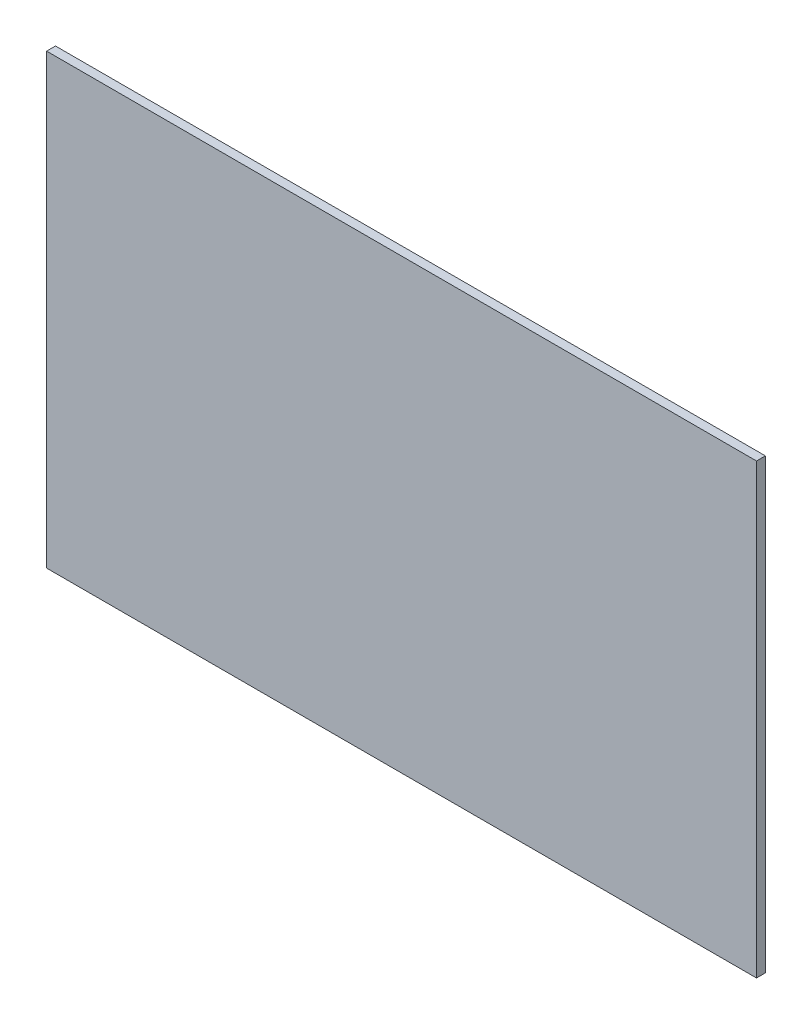
ISO-10303-21;
HEADER;
FILE_DESCRIPTION(('STEP AP214'),'2;1');
FILE_NAME('part.step','',(''),(''),'','','');
FILE_SCHEMA(('AUTOMOTIVE_DESIGN { 1 0 10303 214 1 1 1 1 }'));
ENDSEC;
DATA;
#1=APPLICATION_CONTEXT('core data for automotive mechanical design processes');
#2=APPLICATION_PROTOCOL_DEFINITION('international standard','automotive_design',2000,#1);
#3=PRODUCT_CONTEXT('',#1,'mechanical');
#4=PRODUCT('Part','Part','',(#3));
#5=PRODUCT_RELATED_PRODUCT_CATEGORY('part','',(#4));
#6=PRODUCT_DEFINITION_FORMATION('','',#4);
#7=PRODUCT_DEFINITION_CONTEXT('part definition',#1,'design');
#8=PRODUCT_DEFINITION('design','',#6,#7);
#9=PRODUCT_DEFINITION_SHAPE('','',#8);
#10=(LENGTH_UNIT() NAMED_UNIT(*) SI_UNIT(.MILLI.,.METRE.));
#11=(NAMED_UNIT(*) PLANE_ANGLE_UNIT() SI_UNIT($,.RADIAN.));
#12=(NAMED_UNIT(*) SI_UNIT($,.STERADIAN.) SOLID_ANGLE_UNIT());
#13=UNCERTAINTY_MEASURE_WITH_UNIT(LENGTH_MEASURE(1.E-05),#10,'distance_accuracy_value','');
#14=(GEOMETRIC_REPRESENTATION_CONTEXT(3) GLOBAL_UNCERTAINTY_ASSIGNED_CONTEXT((#13)) GLOBAL_UNIT_ASSIGNED_CONTEXT((#10,
#11,#12)) REPRESENTATION_CONTEXT('',''));
#15=CARTESIAN_POINT('',(0.,0.,0.));
#16=DIRECTION('',(0.,0.,1.));
#17=DIRECTION('',(1.,0.,0.));
#18=AXIS2_PLACEMENT_3D('',#15,#16,#17);
#19=CARTESIAN_POINT('',(762.5,480.95,9.525));
#20=DIRECTION('',(0.,-1.,0.));
#21=DIRECTION('',(0.,0.,-1.));
#22=AXIS2_PLACEMENT_3D('',#19,#20,#21);
#23=PLANE('',#22);
#24=DIRECTION('',(-1.,0.,0.));
#25=VECTOR('',#24,1.);
#26=CARTESIAN_POINT('',(762.5,480.95,0.));
#27=LINE('',#26,#25);
#28=CARTESIAN_POINT('',(762.5,480.95,0.));
#29=VERTEX_POINT('',#28);
#30=CARTESIAN_POINT('',(0.,480.95,0.));
#31=VERTEX_POINT('',#30);
#32=EDGE_CURVE('E104',#29,#31,#27,.T.);
#33=ORIENTED_EDGE('',*,*,#32,.T.);
#34=DIRECTION('',(0.,0.,-1.));
#35=VECTOR('',#34,1.);
#36=CARTESIAN_POINT('',(0.,480.95,9.525));
#37=LINE('',#36,#35);
#38=CARTESIAN_POINT('',(0.,480.95,9.525));
#39=VERTEX_POINT('',#38);
#40=EDGE_CURVE('E11',#39,#31,#37,.T.);
#41=ORIENTED_EDGE('',*,*,#40,.F.);
#42=DIRECTION('',(-1.,0.,0.));
#43=VECTOR('',#42,1.);
#44=CARTESIAN_POINT('',(762.5,480.95,9.525));
#45=LINE('',#44,#43);
#46=CARTESIAN_POINT('',(762.5,480.95,9.525));
#47=VERTEX_POINT('',#46);
#48=EDGE_CURVE('E92',#47,#39,#45,.T.);
#49=ORIENTED_EDGE('',*,*,#48,.F.);
#50=DIRECTION('',(0.,0.,-1.));
#51=VECTOR('',#50,1.);
#52=CARTESIAN_POINT('',(762.5,480.95,9.525));
#53=LINE('',#52,#51);
#54=EDGE_CURVE('E100',#47,#29,#53,.T.);
#55=ORIENTED_EDGE('',*,*,#54,.T.);
#56=EDGE_LOOP('',(#33,#41,#49,#55));
#57=FACE_BOUND('',#56,.T.);
#58=ADVANCED_FACE('F41',(#57),#23,.F.);
#59=CARTESIAN_POINT('',(0.,480.95,9.525));
#60=DIRECTION('',(1.,0.,0.));
#61=DIRECTION('',(0.,0.,-1.));
#62=AXIS2_PLACEMENT_3D('',#59,#60,#61);
#63=PLANE('',#62);
#64=DIRECTION('',(0.,-1.,0.));
#65=VECTOR('',#64,1.);
#66=CARTESIAN_POINT('',(0.,480.95,0.));
#67=LINE('',#66,#65);
#68=CARTESIAN_POINT('',(0.,0.,0.));
#69=VERTEX_POINT('',#68);
#70=EDGE_CURVE('E96',#31,#69,#67,.T.);
#71=ORIENTED_EDGE('',*,*,#70,.T.);
#72=DIRECTION('',(0.,0.,-1.));
#73=VECTOR('',#72,1.);
#74=CARTESIAN_POINT('',(0.,0.,9.525));
#75=LINE('',#74,#73);
#76=CARTESIAN_POINT('',(0.,0.,9.525));
#77=VERTEX_POINT('',#76);
#78=EDGE_CURVE('E49',#77,#69,#75,.T.);
#79=ORIENTED_EDGE('',*,*,#78,.F.);
#80=DIRECTION('',(0.,-1.,0.));
#81=VECTOR('',#80,1.);
#82=CARTESIAN_POINT('',(0.,480.95,9.525));
#83=LINE('',#82,#81);
#84=EDGE_CURVE('E87',#39,#77,#83,.T.);
#85=ORIENTED_EDGE('',*,*,#84,.F.);
#86=ORIENTED_EDGE('',*,*,#40,.T.);
#87=EDGE_LOOP('',(#71,#79,#85,#86));
#88=FACE_BOUND('',#87,.T.);
#89=ADVANCED_FACE('F95',(#88),#63,.F.);
#90=CARTESIAN_POINT('',(0.,0.,9.525));
#91=DIRECTION('',(0.,1.,0.));
#92=DIRECTION('',(0.,0.,1.));
#93=AXIS2_PLACEMENT_3D('',#90,#91,#92);
#94=PLANE('',#93);
#95=DIRECTION('',(1.,0.,0.));
#96=VECTOR('',#95,1.);
#97=CARTESIAN_POINT('',(0.,0.,0.));
#98=LINE('',#97,#96);
#99=CARTESIAN_POINT('',(762.5,0.,0.));
#100=VERTEX_POINT('',#99);
#101=EDGE_CURVE('E74',#69,#100,#98,.T.);
#102=ORIENTED_EDGE('',*,*,#101,.T.);
#103=DIRECTION('',(0.,0.,-1.));
#104=VECTOR('',#103,1.);
#105=CARTESIAN_POINT('',(762.5,0.,9.525));
#106=LINE('',#105,#104);
#107=CARTESIAN_POINT('',(762.5,0.,9.525));
#108=VERTEX_POINT('',#107);
#109=EDGE_CURVE('E97',#108,#100,#106,.T.);
#110=ORIENTED_EDGE('',*,*,#109,.F.);
#111=DIRECTION('',(1.,0.,0.));
#112=VECTOR('',#111,1.);
#113=CARTESIAN_POINT('',(0.,0.,9.525));
#114=LINE('',#113,#112);
#115=EDGE_CURVE('E90',#77,#108,#114,.T.);
#116=ORIENTED_EDGE('',*,*,#115,.F.);
#117=ORIENTED_EDGE('',*,*,#78,.T.);
#118=EDGE_LOOP('',(#102,#110,#116,#117));
#119=FACE_BOUND('',#118,.T.);
#120=ADVANCED_FACE('F98',(#119),#94,.F.);
#121=CARTESIAN_POINT('',(762.5,0.,9.525));
#122=DIRECTION('',(-1.,0.,0.));
#123=DIRECTION('',(0.,0.,1.));
#124=AXIS2_PLACEMENT_3D('',#121,#122,#123);
#125=PLANE('',#124);
#126=DIRECTION('',(0.,1.,0.));
#127=VECTOR('',#126,1.);
#128=CARTESIAN_POINT('',(762.5,0.,0.));
#129=LINE('',#128,#127);
#130=EDGE_CURVE('E80',#100,#29,#129,.T.);
#131=ORIENTED_EDGE('',*,*,#130,.T.);
#132=ORIENTED_EDGE('',*,*,#54,.F.);
#133=DIRECTION('',(0.,1.,0.));
#134=VECTOR('',#133,1.);
#135=CARTESIAN_POINT('',(762.5,0.,9.525));
#136=LINE('',#135,#134);
#137=EDGE_CURVE('E57',#108,#47,#136,.T.);
#138=ORIENTED_EDGE('',*,*,#137,.F.);
#139=ORIENTED_EDGE('',*,*,#109,.T.);
#140=EDGE_LOOP('',(#131,#132,#138,#139));
#141=FACE_BOUND('',#140,.T.);
#142=ADVANCED_FACE('F111',(#141),#125,.F.);
#143=CARTESIAN_POINT('',(0.,0.,9.525));
#144=DIRECTION('',(0.,0.,1.));
#145=DIRECTION('',(1.,0.,0.));
#146=AXIS2_PLACEMENT_3D('',#143,#144,#145);
#147=PLANE('',#146);
#148=ORIENTED_EDGE('',*,*,#48,.T.);
#149=ORIENTED_EDGE('',*,*,#84,.T.);
#150=ORIENTED_EDGE('',*,*,#115,.T.);
#151=ORIENTED_EDGE('',*,*,#137,.T.);
#152=EDGE_LOOP('',(#148,#149,#150,#151));
#153=FACE_BOUND('',#152,.T.);
#154=ADVANCED_FACE('F88',(#153),#147,.T.);
#155=CARTESIAN_POINT('',(0.,0.,0.));
#156=DIRECTION('',(0.,0.,1.));
#157=DIRECTION('',(1.,0.,0.));
#158=AXIS2_PLACEMENT_3D('',#155,#156,#157);
#159=PLANE('',#158);
#160=ORIENTED_EDGE('',*,*,#32,.F.);
#161=ORIENTED_EDGE('',*,*,#130,.F.);
#162=ORIENTED_EDGE('',*,*,#101,.F.);
#163=ORIENTED_EDGE('',*,*,#70,.F.);
#164=EDGE_LOOP('',(#160,#161,#162,#163));
#165=FACE_BOUND('',#164,.T.);
#166=ADVANCED_FACE('F114',(#165),#159,.F.);
#167=CLOSED_SHELL('',(#58,#89,#120,#142,#154,#166));
#168=MANIFOLD_SOLID_BREP('B2',#167);
#169=ADVANCED_BREP_SHAPE_REPRESENTATION('',(#18,#168),#14);
#170=SHAPE_DEFINITION_REPRESENTATION(#9,#169);
ENDSEC;
END-ISO-10303-21;
